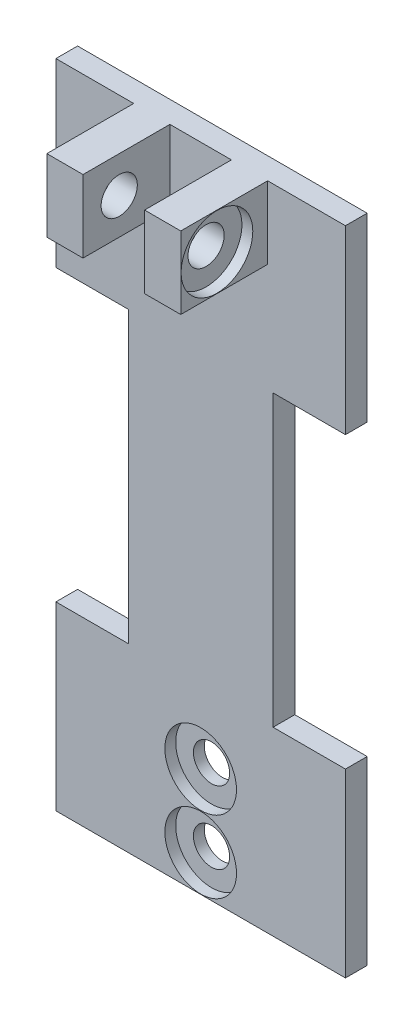
ISO-10303-21;
HEADER;
FILE_DESCRIPTION(('STEP AP214'),'2;1');
FILE_NAME('part.step','',(''),(''),'','','');
FILE_SCHEMA(('AUTOMOTIVE_DESIGN { 1 0 10303 214 1 1 1 1 }'));
ENDSEC;
DATA;
#1=APPLICATION_CONTEXT('core data for automotive mechanical design processes');
#2=APPLICATION_PROTOCOL_DEFINITION('international standard','automotive_design',2000,#1);
#3=PRODUCT_CONTEXT('',#1,'mechanical');
#4=PRODUCT('Part','Part','',(#3));
#5=PRODUCT_RELATED_PRODUCT_CATEGORY('part','',(#4));
#6=PRODUCT_DEFINITION_FORMATION('','',#4);
#7=PRODUCT_DEFINITION_CONTEXT('part definition',#1,'design');
#8=PRODUCT_DEFINITION('design','',#6,#7);
#9=PRODUCT_DEFINITION_SHAPE('','',#8);
#10=(LENGTH_UNIT() NAMED_UNIT(*) SI_UNIT(.MILLI.,.METRE.));
#11=(NAMED_UNIT(*) PLANE_ANGLE_UNIT() SI_UNIT($,.RADIAN.));
#12=(NAMED_UNIT(*) SI_UNIT($,.STERADIAN.) SOLID_ANGLE_UNIT());
#13=UNCERTAINTY_MEASURE_WITH_UNIT(LENGTH_MEASURE(1.E-05),#10,'distance_accuracy_value','');
#14=(GEOMETRIC_REPRESENTATION_CONTEXT(3) GLOBAL_UNCERTAINTY_ASSIGNED_CONTEXT((#13)) GLOBAL_UNIT_ASSIGNED_CONTEXT((#10,
#11,#12)) REPRESENTATION_CONTEXT('',''));
#15=CARTESIAN_POINT('',(0.,0.,0.));
#16=DIRECTION('',(0.,0.,1.));
#17=DIRECTION('',(1.,0.,0.));
#18=AXIS2_PLACEMENT_3D('',#15,#16,#17);
#19=CARTESIAN_POINT('',(0.,0.,3.));
#20=DIRECTION('',(0.,0.,1.));
#21=DIRECTION('',(1.,0.,0.));
#22=AXIS2_PLACEMENT_3D('',#19,#20,#21);
#23=PLANE('',#22);
#24=CARTESIAN_POINT('',(-14.0258823100703,-9.69647058823528,3.));
#25=DIRECTION('',(0.,0.,1.));
#26=DIRECTION('',(1.,0.,0.));
#27=AXIS2_PLACEMENT_3D('',#24,#25,#26);
#28=CIRCLE('',#27,4.95);
#29=CARTESIAN_POINT('',(-9.07588231007033,-9.69647058823528,3.));
#30=VERTEX_POINT('',#29);
#31=EDGE_CURVE('E313',#30,#30,#28,.T.);
#32=ORIENTED_EDGE('',*,*,#31,.F.);
#33=EDGE_LOOP('',(#32));
#34=FACE_BOUND('',#33,.T.);
#35=CARTESIAN_POINT('',(-14.0258823100703,0.303529411764716,3.));
#36=DIRECTION('',(0.,0.,1.));
#37=DIRECTION('',(1.,0.,0.));
#38=AXIS2_PLACEMENT_3D('',#35,#36,#37);
#39=CIRCLE('',#38,4.95);
#40=CARTESIAN_POINT('',(-9.07588231007033,0.303529411764716,3.));
#41=VERTEX_POINT('',#40);
#42=EDGE_CURVE('E317',#41,#41,#39,.T.);
#43=ORIENTED_EDGE('',*,*,#42,.F.);
#44=EDGE_LOOP('',(#43));
#45=FACE_BOUND('',#44,.T.);
#46=DIRECTION('',(1.,0.,0.));
#47=VECTOR('',#46,1.);
#48=CARTESIAN_POINT('',(0.,75.3035294117647,3.));
#49=LINE('',#48,#47);
#50=CARTESIAN_POINT('',(-18.2758823100703,75.3035294117647,3.));
#51=VERTEX_POINT('',#50);
#52=CARTESIAN_POINT('',(-9.77588231007033,75.3035294117647,3.));
#53=VERTEX_POINT('',#52);
#54=EDGE_CURVE('E61',#51,#53,#49,.T.);
#55=ORIENTED_EDGE('',*,*,#54,.F.);
#56=DIRECTION('',(0.,-1.,0.));
#57=VECTOR('',#56,1.);
#58=CARTESIAN_POINT('',(-18.2758823100703,0.,3.));
#59=LINE('',#58,#57);
#60=CARTESIAN_POINT('',(-18.2758823100703,65.3035294117647,3.));
#61=VERTEX_POINT('',#60);
#62=EDGE_CURVE('E213',#51,#61,#59,.T.);
#63=ORIENTED_EDGE('',*,*,#62,.T.);
#64=DIRECTION('',(1.,0.,0.));
#65=VECTOR('',#64,1.);
#66=CARTESIAN_POINT('',(0.,65.3035294117647,3.));
#67=LINE('',#66,#65);
#68=CARTESIAN_POINT('',(-23.2758823100703,65.3035294117647,3.));
#69=VERTEX_POINT('',#68);
#70=EDGE_CURVE('E55',#69,#61,#67,.T.);
#71=ORIENTED_EDGE('',*,*,#70,.F.);
#72=DIRECTION('',(0.,-1.,0.));
#73=VECTOR('',#72,1.);
#74=CARTESIAN_POINT('',(-23.2758823100703,0.,3.));
#75=LINE('',#74,#73);
#76=CARTESIAN_POINT('',(-23.2758823100703,75.3035294117647,3.));
#77=VERTEX_POINT('',#76);
#78=EDGE_CURVE('E210',#77,#69,#75,.T.);
#79=ORIENTED_EDGE('',*,*,#78,.F.);
#80=CARTESIAN_POINT('',(-34.0258823100703,75.3035294117647,3.));
#81=VERTEX_POINT('',#80);
#82=EDGE_CURVE('E281',#81,#77,#49,.T.);
#83=ORIENTED_EDGE('',*,*,#82,.F.);
#84=DIRECTION('',(0.,-1.,0.));
#85=VECTOR('',#84,1.);
#86=CARTESIAN_POINT('',(-34.0258823100703,0.,3.));
#87=LINE('',#86,#85);
#88=CARTESIAN_POINT('',(-34.0258823100703,50.3035294117647,3.));
#89=VERTEX_POINT('',#88);
#90=EDGE_CURVE('E285',#81,#89,#87,.T.);
#91=ORIENTED_EDGE('',*,*,#90,.T.);
#92=DIRECTION('',(1.,0.,0.));
#93=VECTOR('',#92,1.);
#94=CARTESIAN_POINT('',(0.,50.3035294117647,3.));
#95=LINE('',#94,#93);
#96=CARTESIAN_POINT('',(-24.0258823100703,50.3035294117647,3.));
#97=VERTEX_POINT('',#96);
#98=EDGE_CURVE('E288',#89,#97,#95,.T.);
#99=ORIENTED_EDGE('',*,*,#98,.T.);
#100=DIRECTION('',(0.,-1.,0.));
#101=VECTOR('',#100,1.);
#102=CARTESIAN_POINT('',(-24.0258823100703,0.,3.));
#103=LINE('',#102,#101);
#104=CARTESIAN_POINT('',(-24.0258823100703,10.3035294117647,3.));
#105=VERTEX_POINT('',#104);
#106=EDGE_CURVE('E292',#97,#105,#103,.T.);
#107=ORIENTED_EDGE('',*,*,#106,.T.);
#108=DIRECTION('',(1.,0.,0.));
#109=VECTOR('',#108,1.);
#110=CARTESIAN_POINT('',(0.,10.3035294117647,3.));
#111=LINE('',#110,#109);
#112=CARTESIAN_POINT('',(-34.0258823100703,10.3035294117647,3.));
#113=VERTEX_POINT('',#112);
#114=EDGE_CURVE('E295',#113,#105,#111,.T.);
#115=ORIENTED_EDGE('',*,*,#114,.F.);
#116=CARTESIAN_POINT('',(-34.0258823100703,-14.6964705882353,3.));
#117=VERTEX_POINT('',#116);
#118=EDGE_CURVE('E289',#113,#117,#87,.T.);
#119=ORIENTED_EDGE('',*,*,#118,.T.);
#120=DIRECTION('',(1.,0.,0.));
#121=VECTOR('',#120,1.);
#122=CARTESIAN_POINT('',(0.,-14.6964705882353,3.));
#123=LINE('',#122,#121);
#124=CARTESIAN_POINT('',(5.97411768992968,-14.6964705882353,3.));
#125=VERTEX_POINT('',#124);
#126=EDGE_CURVE('E299',#117,#125,#123,.T.);
#127=ORIENTED_EDGE('',*,*,#126,.T.);
#128=DIRECTION('',(0.,-1.,0.));
#129=VECTOR('',#128,1.);
#130=CARTESIAN_POINT('',(5.97411768992968,0.,3.));
#131=LINE('',#130,#129);
#132=CARTESIAN_POINT('',(5.97411768992968,10.3035294117648,3.));
#133=VERTEX_POINT('',#132);
#134=EDGE_CURVE('E280',#133,#125,#131,.T.);
#135=ORIENTED_EDGE('',*,*,#134,.F.);
#136=DIRECTION('',(-1.,0.,0.));
#137=VECTOR('',#136,1.);
#138=CARTESIAN_POINT('',(0.,10.3035294117648,3.));
#139=LINE('',#138,#137);
#140=CARTESIAN_POINT('',(-4.02588231007036,10.3035294117648,3.));
#141=VERTEX_POINT('',#140);
#142=EDGE_CURVE('E302',#133,#141,#139,.T.);
#143=ORIENTED_EDGE('',*,*,#142,.T.);
#144=DIRECTION('',(0.,-1.,0.));
#145=VECTOR('',#144,1.);
#146=CARTESIAN_POINT('',(-4.02588231007036,0.,3.));
#147=LINE('',#146,#145);
#148=CARTESIAN_POINT('',(-4.02588231007036,50.3035294117647,3.));
#149=VERTEX_POINT('',#148);
#150=EDGE_CURVE('E305',#149,#141,#147,.T.);
#151=ORIENTED_EDGE('',*,*,#150,.F.);
#152=DIRECTION('',(-1.,0.,0.));
#153=VECTOR('',#152,1.);
#154=CARTESIAN_POINT('',(0.,50.3035294117647,3.));
#155=LINE('',#154,#153);
#156=CARTESIAN_POINT('',(5.97411768992967,50.3035294117647,3.));
#157=VERTEX_POINT('',#156);
#158=EDGE_CURVE('E309',#157,#149,#155,.T.);
#159=ORIENTED_EDGE('',*,*,#158,.F.);
#160=CARTESIAN_POINT('',(5.97411768992967,75.3035294117647,3.));
#161=VERTEX_POINT('',#160);
#162=EDGE_CURVE('E274',#161,#157,#131,.T.);
#163=ORIENTED_EDGE('',*,*,#162,.F.);
#164=CARTESIAN_POINT('',(-4.77588231007033,75.3035294117647,3.));
#165=VERTEX_POINT('',#164);
#166=EDGE_CURVE('E278',#165,#161,#49,.T.);
#167=ORIENTED_EDGE('',*,*,#166,.F.);
#168=DIRECTION('',(0.,-1.,0.));
#169=VECTOR('',#168,1.);
#170=CARTESIAN_POINT('',(-4.77588231007033,0.,3.));
#171=LINE('',#170,#169);
#172=CARTESIAN_POINT('',(-4.77588231007033,65.3035294117647,3.));
#173=VERTEX_POINT('',#172);
#174=EDGE_CURVE('E249',#165,#173,#171,.T.);
#175=ORIENTED_EDGE('',*,*,#174,.T.);
#176=DIRECTION('',(-1.,0.,0.));
#177=VECTOR('',#176,1.);
#178=CARTESIAN_POINT('',(0.,65.3035294117647,3.));
#179=LINE('',#178,#177);
#180=CARTESIAN_POINT('',(-9.77588231007033,65.3035294117647,3.));
#181=VERTEX_POINT('',#180);
#182=EDGE_CURVE('E253',#173,#181,#179,.T.);
#183=ORIENTED_EDGE('',*,*,#182,.T.);
#184=DIRECTION('',(0.,1.,0.));
#185=VECTOR('',#184,1.);
#186=CARTESIAN_POINT('',(-9.77588231007033,0.,3.));
#187=LINE('',#186,#185);
#188=EDGE_CURVE('E246',#181,#53,#187,.T.);
#189=ORIENTED_EDGE('',*,*,#188,.T.);
#190=EDGE_LOOP('',(#55,#63,#71,#79,#83,#91,#99,#107,#115,#119,#127,#135,#143,#151,#159,#163,
#167,#175,#183,#189));
#191=FACE_BOUND('',#190,.T.);
#192=ADVANCED_FACE('F39',(#34,#45,#191),#23,.T.);
#193=CARTESIAN_POINT('',(5.97411768992968,0.,3.));
#194=DIRECTION('',(1.,0.,0.));
#195=DIRECTION('',(0.,1.,0.));
#196=AXIS2_PLACEMENT_3D('',#193,#194,#195);
#197=PLANE('',#196);
#198=DIRECTION('',(0.,-1.,0.));
#199=VECTOR('',#198,1.);
#200=CARTESIAN_POINT('',(5.97411768992968,0.,0.));
#201=LINE('',#200,#199);
#202=CARTESIAN_POINT('',(5.97411768992967,75.3035294117647,0.));
#203=VERTEX_POINT('',#202);
#204=CARTESIAN_POINT('',(5.97411768992967,50.3035294117647,0.));
#205=VERTEX_POINT('',#204);
#206=EDGE_CURVE('E270',#203,#205,#201,.T.);
#207=ORIENTED_EDGE('',*,*,#206,.F.);
#208=DIRECTION('',(0.,0.,-1.));
#209=VECTOR('',#208,1.);
#210=CARTESIAN_POINT('',(5.97411768992967,75.3035294117647,3.));
#211=LINE('',#210,#209);
#212=EDGE_CURVE('E394',#161,#203,#211,.T.);
#213=ORIENTED_EDGE('',*,*,#212,.F.);
#214=ORIENTED_EDGE('',*,*,#162,.T.);
#215=DIRECTION('',(0.,0.,-1.));
#216=VECTOR('',#215,1.);
#217=CARTESIAN_POINT('',(5.97411768992967,50.3035294117647,3.));
#218=LINE('',#217,#216);
#219=EDGE_CURVE('E321',#157,#205,#218,.T.);
#220=ORIENTED_EDGE('',*,*,#219,.T.);
#221=EDGE_LOOP('',(#207,#213,#214,#220));
#222=FACE_BOUND('',#221,.T.);
#223=ADVANCED_FACE('F412',(#222),#197,.T.);
#224=CARTESIAN_POINT('',(0.,75.3035294117647,3.));
#225=DIRECTION('',(0.,1.,0.));
#226=DIRECTION('',(0.,0.,1.));
#227=AXIS2_PLACEMENT_3D('',#224,#225,#226);
#228=PLANE('',#227);
#229=ORIENTED_EDGE('',*,*,#82,.T.);
#230=DIRECTION('',(0.,0.,-1.));
#231=VECTOR('',#230,1.);
#232=CARTESIAN_POINT('',(-23.2758823100703,75.3035294117647,15.));
#233=LINE('',#232,#231);
#234=CARTESIAN_POINT('',(-23.2758823100703,75.3035294117647,15.));
#235=VERTEX_POINT('',#234);
#236=EDGE_CURVE('E814',#235,#77,#233,.T.);
#237=ORIENTED_EDGE('',*,*,#236,.F.);
#238=DIRECTION('',(-1.,0.,0.));
#239=VECTOR('',#238,1.);
#240=CARTESIAN_POINT('',(-18.2758823100703,75.3035294117647,15.));
#241=LINE('',#240,#239);
#242=CARTESIAN_POINT('',(-18.2758823100703,75.3035294117647,15.));
#243=VERTEX_POINT('',#242);
#244=EDGE_CURVE('E194',#243,#235,#241,.T.);
#245=ORIENTED_EDGE('',*,*,#244,.F.);
#246=DIRECTION('',(0.,0.,-1.));
#247=VECTOR('',#246,1.);
#248=CARTESIAN_POINT('',(-18.2758823100703,75.3035294117647,15.));
#249=LINE('',#248,#247);
#250=EDGE_CURVE('E191',#243,#51,#249,.T.);
#251=ORIENTED_EDGE('',*,*,#250,.T.);
#252=ORIENTED_EDGE('',*,*,#54,.T.);
#253=DIRECTION('',(0.,0.,-1.));
#254=VECTOR('',#253,1.);
#255=CARTESIAN_POINT('',(-9.77588231007033,75.3035294117647,15.));
#256=LINE('',#255,#254);
#257=CARTESIAN_POINT('',(-9.77588231007033,75.3035294117647,15.));
#258=VERTEX_POINT('',#257);
#259=EDGE_CURVE('E234',#258,#53,#256,.T.);
#260=ORIENTED_EDGE('',*,*,#259,.F.);
#261=DIRECTION('',(1.,0.,0.));
#262=VECTOR('',#261,1.);
#263=CARTESIAN_POINT('',(0.,75.3035294117647,15.));
#264=LINE('',#263,#262);
#265=CARTESIAN_POINT('',(-4.77588231007033,75.3035294117647,15.));
#266=VERTEX_POINT('',#265);
#267=EDGE_CURVE('E223',#258,#266,#264,.T.);
#268=ORIENTED_EDGE('',*,*,#267,.T.);
#269=DIRECTION('',(0.,0.,-1.));
#270=VECTOR('',#269,1.);
#271=CARTESIAN_POINT('',(-4.77588231007033,75.3035294117647,15.));
#272=LINE('',#271,#270);
#273=EDGE_CURVE('E238',#266,#165,#272,.T.);
#274=ORIENTED_EDGE('',*,*,#273,.T.);
#275=ORIENTED_EDGE('',*,*,#166,.T.);
#276=ORIENTED_EDGE('',*,*,#212,.T.);
#277=DIRECTION('',(1.,0.,0.));
#278=VECTOR('',#277,1.);
#279=CARTESIAN_POINT('',(0.,75.3035294117647,0.));
#280=LINE('',#279,#278);
#281=CARTESIAN_POINT('',(-34.0258823100703,75.3035294117647,0.));
#282=VERTEX_POINT('',#281);
#283=EDGE_CURVE('E325',#282,#203,#280,.T.);
#284=ORIENTED_EDGE('',*,*,#283,.F.);
#285=DIRECTION('',(0.,0.,-1.));
#286=VECTOR('',#285,1.);
#287=CARTESIAN_POINT('',(-34.0258823100703,75.3035294117647,3.));
#288=LINE('',#287,#286);
#289=EDGE_CURVE('E391',#81,#282,#288,.T.);
#290=ORIENTED_EDGE('',*,*,#289,.F.);
#291=EDGE_LOOP('',(#229,#237,#245,#251,#252,#260,#268,#274,#275,#276,#284,#290));
#292=FACE_BOUND('',#291,.T.);
#293=ADVANCED_FACE('F41',(#292),#228,.T.);
#294=CARTESIAN_POINT('',(-34.0258823100703,0.,3.));
#295=DIRECTION('',(1.,0.,0.));
#296=DIRECTION('',(0.,1.,0.));
#297=AXIS2_PLACEMENT_3D('',#294,#295,#296);
#298=PLANE('',#297);
#299=DIRECTION('',(0.,-1.,0.));
#300=VECTOR('',#299,1.);
#301=CARTESIAN_POINT('',(-34.0258823100703,0.,0.));
#302=LINE('',#301,#300);
#303=CARTESIAN_POINT('',(-34.0258823100703,50.3035294117647,0.));
#304=VERTEX_POINT('',#303);
#305=EDGE_CURVE('E329',#282,#304,#302,.T.);
#306=ORIENTED_EDGE('',*,*,#305,.T.);
#307=DIRECTION('',(0.,0.,-1.));
#308=VECTOR('',#307,1.);
#309=CARTESIAN_POINT('',(-34.0258823100703,50.3035294117647,3.));
#310=LINE('',#309,#308);
#311=EDGE_CURVE('E387',#89,#304,#310,.T.);
#312=ORIENTED_EDGE('',*,*,#311,.F.);
#313=ORIENTED_EDGE('',*,*,#90,.F.);
#314=ORIENTED_EDGE('',*,*,#289,.T.);
#315=EDGE_LOOP('',(#306,#312,#313,#314));
#316=FACE_BOUND('',#315,.T.);
#317=ADVANCED_FACE('F455',(#316),#298,.F.);
#318=CARTESIAN_POINT('',(0.,50.3035294117647,3.));
#319=DIRECTION('',(0.,1.,0.));
#320=DIRECTION('',(0.,0.,1.));
#321=AXIS2_PLACEMENT_3D('',#318,#319,#320);
#322=PLANE('',#321);
#323=DIRECTION('',(1.,0.,0.));
#324=VECTOR('',#323,1.);
#325=CARTESIAN_POINT('',(0.,50.3035294117647,0.));
#326=LINE('',#325,#324);
#327=CARTESIAN_POINT('',(-24.0258823100703,50.3035294117647,0.));
#328=VERTEX_POINT('',#327);
#329=EDGE_CURVE('E332',#304,#328,#326,.T.);
#330=ORIENTED_EDGE('',*,*,#329,.T.);
#331=DIRECTION('',(0.,0.,-1.));
#332=VECTOR('',#331,1.);
#333=CARTESIAN_POINT('',(-24.0258823100703,50.3035294117647,3.));
#334=LINE('',#333,#332);
#335=EDGE_CURVE('E383',#97,#328,#334,.T.);
#336=ORIENTED_EDGE('',*,*,#335,.F.);
#337=ORIENTED_EDGE('',*,*,#98,.F.);
#338=ORIENTED_EDGE('',*,*,#311,.T.);
#339=EDGE_LOOP('',(#330,#336,#337,#338));
#340=FACE_BOUND('',#339,.T.);
#341=ADVANCED_FACE('F461',(#340),#322,.F.);
#342=CARTESIAN_POINT('',(-24.0258823100703,0.,3.));
#343=DIRECTION('',(1.,0.,0.));
#344=DIRECTION('',(0.,1.,0.));
#345=AXIS2_PLACEMENT_3D('',#342,#343,#344);
#346=PLANE('',#345);
#347=DIRECTION('',(0.,-1.,0.));
#348=VECTOR('',#347,1.);
#349=CARTESIAN_POINT('',(-24.0258823100703,0.,0.));
#350=LINE('',#349,#348);
#351=CARTESIAN_POINT('',(-24.0258823100703,10.3035294117647,0.));
#352=VERTEX_POINT('',#351);
#353=EDGE_CURVE('E336',#328,#352,#350,.T.);
#354=ORIENTED_EDGE('',*,*,#353,.T.);
#355=DIRECTION('',(0.,0.,-1.));
#356=VECTOR('',#355,1.);
#357=CARTESIAN_POINT('',(-24.0258823100703,10.3035294117647,3.));
#358=LINE('',#357,#356);
#359=EDGE_CURVE('E380',#105,#352,#358,.T.);
#360=ORIENTED_EDGE('',*,*,#359,.F.);
#361=ORIENTED_EDGE('',*,*,#106,.F.);
#362=ORIENTED_EDGE('',*,*,#335,.T.);
#363=EDGE_LOOP('',(#354,#360,#361,#362));
#364=FACE_BOUND('',#363,.T.);
#365=ADVANCED_FACE('F458',(#364),#346,.F.);
#366=CARTESIAN_POINT('',(0.,10.3035294117647,3.));
#367=DIRECTION('',(0.,1.,0.));
#368=DIRECTION('',(-1.,0.,0.));
#369=AXIS2_PLACEMENT_3D('',#366,#367,#368);
#370=PLANE('',#369);
#371=DIRECTION('',(1.,0.,0.));
#372=VECTOR('',#371,1.);
#373=CARTESIAN_POINT('',(0.,10.3035294117647,0.));
#374=LINE('',#373,#372);
#375=CARTESIAN_POINT('',(-34.0258823100703,10.3035294117647,0.));
#376=VERTEX_POINT('',#375);
#377=EDGE_CURVE('E340',#376,#352,#374,.T.);
#378=ORIENTED_EDGE('',*,*,#377,.F.);
#379=DIRECTION('',(0.,0.,-1.));
#380=VECTOR('',#379,1.);
#381=CARTESIAN_POINT('',(-34.0258823100703,10.3035294117647,3.));
#382=LINE('',#381,#380);
#383=EDGE_CURVE('E377',#113,#376,#382,.T.);
#384=ORIENTED_EDGE('',*,*,#383,.F.);
#385=ORIENTED_EDGE('',*,*,#114,.T.);
#386=ORIENTED_EDGE('',*,*,#359,.T.);
#387=EDGE_LOOP('',(#378,#384,#385,#386));
#388=FACE_BOUND('',#387,.T.);
#389=ADVANCED_FACE('F453',(#388),#370,.T.);
#390=CARTESIAN_POINT('',(-34.0258823100703,-14.6964705882353,0.));
#391=VERTEX_POINT('',#390);
#392=EDGE_CURVE('E333',#376,#391,#302,.T.);
#393=ORIENTED_EDGE('',*,*,#392,.T.);
#394=DIRECTION('',(0.,0.,-1.));
#395=VECTOR('',#394,1.);
#396=CARTESIAN_POINT('',(-34.0258823100703,-14.6964705882353,3.));
#397=LINE('',#396,#395);
#398=EDGE_CURVE('E373',#117,#391,#397,.T.);
#399=ORIENTED_EDGE('',*,*,#398,.F.);
#400=ORIENTED_EDGE('',*,*,#118,.F.);
#401=ORIENTED_EDGE('',*,*,#383,.T.);
#402=EDGE_LOOP('',(#393,#399,#400,#401));
#403=FACE_BOUND('',#402,.T.);
#404=ADVANCED_FACE('F449',(#403),#298,.F.);
#405=CARTESIAN_POINT('',(0.,-14.6964705882353,3.));
#406=DIRECTION('',(0.,1.,0.));
#407=DIRECTION('',(0.,0.,1.));
#408=AXIS2_PLACEMENT_3D('',#405,#406,#407);
#409=PLANE('',#408);
#410=DIRECTION('',(1.,0.,0.));
#411=VECTOR('',#410,1.);
#412=CARTESIAN_POINT('',(0.,-14.6964705882353,0.));
#413=LINE('',#412,#411);
#414=CARTESIAN_POINT('',(5.97411768992968,-14.6964705882353,0.));
#415=VERTEX_POINT('',#414);
#416=EDGE_CURVE('E344',#391,#415,#413,.T.);
#417=ORIENTED_EDGE('',*,*,#416,.T.);
#418=DIRECTION('',(0.,0.,-1.));
#419=VECTOR('',#418,1.);
#420=CARTESIAN_POINT('',(5.97411768992968,-14.6964705882353,3.));
#421=LINE('',#420,#419);
#422=EDGE_CURVE('E370',#125,#415,#421,.T.);
#423=ORIENTED_EDGE('',*,*,#422,.F.);
#424=ORIENTED_EDGE('',*,*,#126,.F.);
#425=ORIENTED_EDGE('',*,*,#398,.T.);
#426=EDGE_LOOP('',(#417,#423,#424,#425));
#427=FACE_BOUND('',#426,.T.);
#428=ADVANCED_FACE('F445',(#427),#409,.F.);
#429=CARTESIAN_POINT('',(5.97411768992968,10.3035294117648,0.));
#430=VERTEX_POINT('',#429);
#431=EDGE_CURVE('E326',#430,#415,#201,.T.);
#432=ORIENTED_EDGE('',*,*,#431,.F.);
#433=DIRECTION('',(0.,0.,-1.));
#434=VECTOR('',#433,1.);
#435=CARTESIAN_POINT('',(5.97411768992968,10.3035294117648,3.));
#436=LINE('',#435,#434);
#437=EDGE_CURVE('E367',#133,#430,#436,.T.);
#438=ORIENTED_EDGE('',*,*,#437,.F.);
#439=ORIENTED_EDGE('',*,*,#134,.T.);
#440=ORIENTED_EDGE('',*,*,#422,.T.);
#441=EDGE_LOOP('',(#432,#438,#439,#440));
#442=FACE_BOUND('',#441,.T.);
#443=ADVANCED_FACE('F420',(#442),#197,.T.);
#444=CARTESIAN_POINT('',(0.,10.3035294117648,3.));
#445=DIRECTION('',(0.,-1.,0.));
#446=DIRECTION('',(1.,0.,0.));
#447=AXIS2_PLACEMENT_3D('',#444,#445,#446);
#448=PLANE('',#447);
#449=DIRECTION('',(-1.,0.,0.));
#450=VECTOR('',#449,1.);
#451=CARTESIAN_POINT('',(0.,10.3035294117648,0.));
#452=LINE('',#451,#450);
#453=CARTESIAN_POINT('',(-4.02588231007036,10.3035294117648,0.));
#454=VERTEX_POINT('',#453);
#455=EDGE_CURVE('E348',#430,#454,#452,.T.);
#456=ORIENTED_EDGE('',*,*,#455,.T.);
#457=DIRECTION('',(0.,0.,-1.));
#458=VECTOR('',#457,1.);
#459=CARTESIAN_POINT('',(-4.02588231007036,10.3035294117648,3.));
#460=LINE('',#459,#458);
#461=EDGE_CURVE('E364',#141,#454,#460,.T.);
#462=ORIENTED_EDGE('',*,*,#461,.F.);
#463=ORIENTED_EDGE('',*,*,#142,.F.);
#464=ORIENTED_EDGE('',*,*,#437,.T.);
#465=EDGE_LOOP('',(#456,#462,#463,#464));
#466=FACE_BOUND('',#465,.T.);
#467=ADVANCED_FACE('F439',(#466),#448,.F.);
#468=CARTESIAN_POINT('',(-4.02588231007036,0.,3.));
#469=DIRECTION('',(1.,0.,0.));
#470=DIRECTION('',(0.,1.,0.));
#471=AXIS2_PLACEMENT_3D('',#468,#469,#470);
#472=PLANE('',#471);
#473=DIRECTION('',(0.,-1.,0.));
#474=VECTOR('',#473,1.);
#475=CARTESIAN_POINT('',(-4.02588231007036,0.,0.));
#476=LINE('',#475,#474);
#477=CARTESIAN_POINT('',(-4.02588231007036,50.3035294117647,0.));
#478=VERTEX_POINT('',#477);
#479=EDGE_CURVE('E352',#478,#454,#476,.T.);
#480=ORIENTED_EDGE('',*,*,#479,.F.);
#481=DIRECTION('',(0.,0.,-1.));
#482=VECTOR('',#481,1.);
#483=CARTESIAN_POINT('',(-4.02588231007036,50.3035294117647,3.));
#484=LINE('',#483,#482);
#485=EDGE_CURVE('E361',#149,#478,#484,.T.);
#486=ORIENTED_EDGE('',*,*,#485,.F.);
#487=ORIENTED_EDGE('',*,*,#150,.T.);
#488=ORIENTED_EDGE('',*,*,#461,.T.);
#489=EDGE_LOOP('',(#480,#486,#487,#488));
#490=FACE_BOUND('',#489,.T.);
#491=ADVANCED_FACE('F432',(#490),#472,.T.);
#492=CARTESIAN_POINT('',(-14.0258823100703,-9.69647058823528,3.));
#493=DIRECTION('',(0.,0.,-1.));
#494=DIRECTION('',(-1.,0.,0.));
#495=AXIS2_PLACEMENT_3D('',#492,#493,#494);
#496=CYLINDRICAL_SURFACE('',#495,4.95);
#497=CARTESIAN_POINT('',(-14.0258823100703,-9.69647058823528,1.5));
#498=DIRECTION('',(0.,0.,1.));
#499=DIRECTION('',(1.,0.,0.));
#500=AXIS2_PLACEMENT_3D('',#497,#498,#499);
#501=CIRCLE('',#500,4.95);
#502=CARTESIAN_POINT('',(-9.07588231007033,-9.69647058823528,1.5));
#503=VERTEX_POINT('',#502);
#504=EDGE_CURVE('E11',#503,#503,#501,.T.);
#505=ORIENTED_EDGE('',*,*,#504,.F.);
#506=EDGE_LOOP('',(#505));
#507=FACE_BOUND('',#506,.T.);
#508=ORIENTED_EDGE('',*,*,#31,.T.);
#509=EDGE_LOOP('',(#508));
#510=FACE_BOUND('',#509,.T.);
#511=ADVANCED_FACE('F429',(#507,#510),#496,.F.);
#512=CARTESIAN_POINT('',(0.,50.3035294117647,3.));
#513=DIRECTION('',(0.,-1.,0.));
#514=DIRECTION('',(0.,0.,-1.));
#515=AXIS2_PLACEMENT_3D('',#512,#513,#514);
#516=PLANE('',#515);
#517=DIRECTION('',(-1.,0.,0.));
#518=VECTOR('',#517,1.);
#519=CARTESIAN_POINT('',(0.,50.3035294117647,0.));
#520=LINE('',#519,#518);
#521=EDGE_CURVE('E279',#205,#478,#520,.T.);
#522=ORIENTED_EDGE('',*,*,#521,.F.);
#523=ORIENTED_EDGE('',*,*,#219,.F.);
#524=ORIENTED_EDGE('',*,*,#158,.T.);
#525=ORIENTED_EDGE('',*,*,#485,.T.);
#526=EDGE_LOOP('',(#522,#523,#524,#525));
#527=FACE_BOUND('',#526,.T.);
#528=ADVANCED_FACE('F407',(#527),#516,.T.);
#529=CARTESIAN_POINT('',(-14.0258823100703,0.303529411764716,3.));
#530=DIRECTION('',(0.,0.,-1.));
#531=DIRECTION('',(-1.,0.,0.));
#532=AXIS2_PLACEMENT_3D('',#529,#530,#531);
#533=CYLINDRICAL_SURFACE('',#532,4.95);
#534=CARTESIAN_POINT('',(-14.0258823100703,0.303529411764716,1.5));
#535=DIRECTION('',(0.,0.,1.));
#536=DIRECTION('',(1.,0.,0.));
#537=AXIS2_PLACEMENT_3D('',#534,#535,#536);
#538=CIRCLE('',#537,4.95);
#539=CARTESIAN_POINT('',(-9.07588231007033,0.303529411764716,1.5));
#540=VERTEX_POINT('',#539);
#541=EDGE_CURVE('E48',#540,#540,#538,.T.);
#542=ORIENTED_EDGE('',*,*,#541,.F.);
#543=EDGE_LOOP('',(#542));
#544=FACE_BOUND('',#543,.T.);
#545=ORIENTED_EDGE('',*,*,#42,.T.);
#546=EDGE_LOOP('',(#545));
#547=FACE_BOUND('',#546,.T.);
#548=ADVANCED_FACE('F403',(#544,#547),#533,.F.);
#549=CARTESIAN_POINT('',(0.,0.,0.));
#550=DIRECTION('',(0.,0.,1.));
#551=DIRECTION('',(1.,0.,0.));
#552=AXIS2_PLACEMENT_3D('',#549,#550,#551);
#553=PLANE('',#552);
#554=ORIENTED_EDGE('',*,*,#283,.T.);
#555=ORIENTED_EDGE('',*,*,#206,.T.);
#556=ORIENTED_EDGE('',*,*,#521,.T.);
#557=ORIENTED_EDGE('',*,*,#479,.T.);
#558=ORIENTED_EDGE('',*,*,#455,.F.);
#559=ORIENTED_EDGE('',*,*,#431,.T.);
#560=ORIENTED_EDGE('',*,*,#416,.F.);
#561=ORIENTED_EDGE('',*,*,#392,.F.);
#562=ORIENTED_EDGE('',*,*,#377,.T.);
#563=ORIENTED_EDGE('',*,*,#353,.F.);
#564=ORIENTED_EDGE('',*,*,#329,.F.);
#565=ORIENTED_EDGE('',*,*,#305,.F.);
#566=EDGE_LOOP('',(#554,#555,#556,#557,#558,#559,#560,#561,#562,#563,#564,#565));
#567=FACE_BOUND('',#566,.T.);
#568=CARTESIAN_POINT('',(-14.0258823100703,0.303529411764716,0.));
#569=DIRECTION('',(0.,0.,1.));
#570=DIRECTION('',(1.,0.,0.));
#571=AXIS2_PLACEMENT_3D('',#568,#569,#570);
#572=CIRCLE('',#571,2.5);
#573=CARTESIAN_POINT('',(-11.5258823100703,0.303529411764716,0.));
#574=VERTEX_POINT('',#573);
#575=EDGE_CURVE('E262',#574,#574,#572,.T.);
#576=ORIENTED_EDGE('',*,*,#575,.T.);
#577=EDGE_LOOP('',(#576));
#578=FACE_BOUND('',#577,.T.);
#579=CARTESIAN_POINT('',(-14.0258823100703,-9.69647058823528,0.));
#580=DIRECTION('',(0.,0.,1.));
#581=DIRECTION('',(1.,0.,0.));
#582=AXIS2_PLACEMENT_3D('',#579,#580,#581);
#583=CIRCLE('',#582,2.5);
#584=CARTESIAN_POINT('',(-11.5258823100703,-9.69647058823528,0.));
#585=VERTEX_POINT('',#584);
#586=EDGE_CURVE('E257',#585,#585,#583,.T.);
#587=ORIENTED_EDGE('',*,*,#586,.T.);
#588=EDGE_LOOP('',(#587));
#589=FACE_BOUND('',#588,.T.);
#590=ADVANCED_FACE('F406',(#567,#578,#589),#553,.F.);
#591=CARTESIAN_POINT('',(-14.0258823100703,0.303529411764716,1.5));
#592=DIRECTION('',(0.,0.,-1.));
#593=DIRECTION('',(-1.,0.,0.));
#594=AXIS2_PLACEMENT_3D('',#591,#592,#593);
#595=CYLINDRICAL_SURFACE('',#594,2.5);
#596=CARTESIAN_POINT('',(-14.0258823100703,0.303529411764716,1.5));
#597=DIRECTION('',(0.,0.,1.));
#598=DIRECTION('',(1.,0.,0.));
#599=AXIS2_PLACEMENT_3D('',#596,#597,#598);
#600=CIRCLE('',#599,2.5);
#601=CARTESIAN_POINT('',(-11.5258823100703,0.303529411764716,1.5));
#602=VERTEX_POINT('',#601);
#603=EDGE_CURVE('E266',#602,#602,#600,.T.);
#604=ORIENTED_EDGE('',*,*,#603,.T.);
#605=EDGE_LOOP('',(#604));
#606=FACE_BOUND('',#605,.T.);
#607=ORIENTED_EDGE('',*,*,#575,.F.);
#608=EDGE_LOOP('',(#607));
#609=FACE_BOUND('',#608,.T.);
#610=ADVANCED_FACE('F424',(#606,#609),#595,.F.);
#611=CARTESIAN_POINT('',(0.,0.,1.5));
#612=DIRECTION('',(0.,0.,1.));
#613=DIRECTION('',(1.,0.,0.));
#614=AXIS2_PLACEMENT_3D('',#611,#612,#613);
#615=PLANE('',#614);
#616=ORIENTED_EDGE('',*,*,#603,.F.);
#617=EDGE_LOOP('',(#616));
#618=FACE_BOUND('',#617,.T.);
#619=ORIENTED_EDGE('',*,*,#541,.T.);
#620=EDGE_LOOP('',(#619));
#621=FACE_BOUND('',#620,.T.);
#622=ADVANCED_FACE('F401',(#618,#621),#615,.T.);
#623=CARTESIAN_POINT('',(-14.0258823100703,-9.69647058823528,1.5));
#624=DIRECTION('',(0.,0.,-1.));
#625=DIRECTION('',(-1.,0.,0.));
#626=AXIS2_PLACEMENT_3D('',#623,#624,#625);
#627=CYLINDRICAL_SURFACE('',#626,2.5);
#628=CARTESIAN_POINT('',(-14.0258823100703,-9.69647058823528,1.5));
#629=DIRECTION('',(0.,0.,1.));
#630=DIRECTION('',(1.,0.,0.));
#631=AXIS2_PLACEMENT_3D('',#628,#629,#630);
#632=CIRCLE('',#631,2.5);
#633=CARTESIAN_POINT('',(-11.5258823100703,-9.69647058823528,1.5));
#634=VERTEX_POINT('',#633);
#635=EDGE_CURVE('E258',#634,#634,#632,.T.);
#636=ORIENTED_EDGE('',*,*,#635,.T.);
#637=EDGE_LOOP('',(#636));
#638=FACE_BOUND('',#637,.T.);
#639=ORIENTED_EDGE('',*,*,#586,.F.);
#640=EDGE_LOOP('',(#639));
#641=FACE_BOUND('',#640,.T.);
#642=ADVANCED_FACE('F547',(#638,#641),#627,.F.);
#643=CARTESIAN_POINT('',(0.,0.,1.5));
#644=DIRECTION('',(0.,0.,1.));
#645=DIRECTION('',(1.,0.,0.));
#646=AXIS2_PLACEMENT_3D('',#643,#644,#645);
#647=PLANE('',#646);
#648=ORIENTED_EDGE('',*,*,#635,.F.);
#649=EDGE_LOOP('',(#648));
#650=FACE_BOUND('',#649,.T.);
#651=ORIENTED_EDGE('',*,*,#504,.T.);
#652=EDGE_LOOP('',(#651));
#653=FACE_BOUND('',#652,.T.);
#654=ADVANCED_FACE('F544',(#650,#653),#647,.T.);
#655=CARTESIAN_POINT('',(0.,65.3035294117647,15.));
#656=DIRECTION('',(0.,1.,0.));
#657=DIRECTION('',(0.,0.,1.));
#658=AXIS2_PLACEMENT_3D('',#655,#656,#657);
#659=PLANE('',#658);
#660=ORIENTED_EDGE('',*,*,#182,.F.);
#661=DIRECTION('',(0.,0.,-1.));
#662=VECTOR('',#661,1.);
#663=CARTESIAN_POINT('',(-4.77588231007033,65.3035294117647,15.));
#664=LINE('',#663,#662);
#665=CARTESIAN_POINT('',(-4.77588231007033,65.3035294117647,15.));
#666=VERTEX_POINT('',#665);
#667=EDGE_CURVE('E242',#666,#173,#664,.T.);
#668=ORIENTED_EDGE('',*,*,#667,.F.);
#669=DIRECTION('',(1.,0.,0.));
#670=VECTOR('',#669,1.);
#671=CARTESIAN_POINT('',(0.,65.3035294117647,15.));
#672=LINE('',#671,#670);
#673=CARTESIAN_POINT('',(-9.77588231007033,65.3035294117647,15.));
#674=VERTEX_POINT('',#673);
#675=EDGE_CURVE('E216',#674,#666,#672,.T.);
#676=ORIENTED_EDGE('',*,*,#675,.F.);
#677=DIRECTION('',(0.,0.,-1.));
#678=VECTOR('',#677,1.);
#679=CARTESIAN_POINT('',(-9.77588231007033,65.3035294117647,15.));
#680=LINE('',#679,#678);
#681=EDGE_CURVE('E230',#674,#181,#680,.T.);
#682=ORIENTED_EDGE('',*,*,#681,.T.);
#683=EDGE_LOOP('',(#660,#668,#676,#682));
#684=FACE_BOUND('',#683,.T.);
#685=ADVANCED_FACE('F518',(#684),#659,.F.);
#686=CARTESIAN_POINT('',(-4.77588231007033,0.,15.));
#687=DIRECTION('',(-1.,0.,0.));
#688=DIRECTION('',(0.,0.,1.));
#689=AXIS2_PLACEMENT_3D('',#686,#687,#688);
#690=PLANE('',#689);
#691=CARTESIAN_POINT('',(-4.77588231007033,70.3035294117647,10.));
#692=DIRECTION('',(1.,0.,0.));
#693=DIRECTION('',(0.,0.,-1.));
#694=AXIS2_PLACEMENT_3D('',#691,#692,#693);
#695=CIRCLE('',#694,4.95);
#696=CARTESIAN_POINT('',(-4.77588231007033,70.3035294117647,5.05000000000001));
#697=VERTEX_POINT('',#696);
#698=EDGE_CURVE('E822',#697,#697,#695,.T.);
#699=ORIENTED_EDGE('',*,*,#698,.F.);
#700=EDGE_LOOP('',(#699));
#701=FACE_BOUND('',#700,.T.);
#702=ORIENTED_EDGE('',*,*,#174,.F.);
#703=ORIENTED_EDGE('',*,*,#273,.F.);
#704=DIRECTION('',(0.,1.,0.));
#705=VECTOR('',#704,1.);
#706=CARTESIAN_POINT('',(-4.77588231007033,0.,15.));
#707=LINE('',#706,#705);
#708=EDGE_CURVE('E220',#666,#266,#707,.T.);
#709=ORIENTED_EDGE('',*,*,#708,.F.);
#710=ORIENTED_EDGE('',*,*,#667,.T.);
#711=EDGE_LOOP('',(#702,#703,#709,#710));
#712=FACE_BOUND('',#711,.T.);
#713=ADVANCED_FACE('F521',(#701,#712),#690,.F.);
#714=CARTESIAN_POINT('',(-9.77588231007033,0.,15.));
#715=DIRECTION('',(1.,0.,0.));
#716=DIRECTION('',(0.,0.,-1.));
#717=AXIS2_PLACEMENT_3D('',#714,#715,#716);
#718=PLANE('',#717);
#719=CARTESIAN_POINT('',(-9.77588231007033,70.3035294117647,10.));
#720=DIRECTION('',(1.,0.,0.));
#721=DIRECTION('',(0.,0.,-1.));
#722=AXIS2_PLACEMENT_3D('',#719,#720,#721);
#723=CIRCLE('',#722,2.5);
#724=CARTESIAN_POINT('',(-9.77588231007033,70.3035294117647,7.5));
#725=VERTEX_POINT('',#724);
#726=EDGE_CURVE('E832',#725,#725,#723,.T.);
#727=ORIENTED_EDGE('',*,*,#726,.T.);
#728=EDGE_LOOP('',(#727));
#729=FACE_BOUND('',#728,.T.);
#730=ORIENTED_EDGE('',*,*,#188,.F.);
#731=ORIENTED_EDGE('',*,*,#681,.F.);
#732=DIRECTION('',(0.,-1.,0.));
#733=VECTOR('',#732,1.);
#734=CARTESIAN_POINT('',(-9.77588231007033,0.,15.));
#735=LINE('',#734,#733);
#736=EDGE_CURVE('E227',#258,#674,#735,.T.);
#737=ORIENTED_EDGE('',*,*,#736,.F.);
#738=ORIENTED_EDGE('',*,*,#259,.T.);
#739=EDGE_LOOP('',(#730,#731,#737,#738));
#740=FACE_BOUND('',#739,.T.);
#741=ADVANCED_FACE('F513',(#729,#740),#718,.F.);
#742=CARTESIAN_POINT('',(0.,0.,15.));
#743=DIRECTION('',(0.,0.,1.));
#744=DIRECTION('',(1.,0.,0.));
#745=AXIS2_PLACEMENT_3D('',#742,#743,#744);
#746=PLANE('',#745);
#747=ORIENTED_EDGE('',*,*,#675,.T.);
#748=ORIENTED_EDGE('',*,*,#708,.T.);
#749=ORIENTED_EDGE('',*,*,#267,.F.);
#750=ORIENTED_EDGE('',*,*,#736,.T.);
#751=EDGE_LOOP('',(#747,#748,#749,#750));
#752=FACE_BOUND('',#751,.T.);
#753=ADVANCED_FACE('F524',(#752),#746,.T.);
#754=CARTESIAN_POINT('',(-18.2758823100703,65.3035294117647,15.));
#755=DIRECTION('',(-1.,0.,0.));
#756=DIRECTION('',(0.,0.,1.));
#757=AXIS2_PLACEMENT_3D('',#754,#755,#756);
#758=PLANE('',#757);
#759=CARTESIAN_POINT('',(-18.2758823100703,70.3035294117647,10.));
#760=DIRECTION('',(-1.,0.,0.));
#761=DIRECTION('',(0.,0.,1.));
#762=AXIS2_PLACEMENT_3D('',#759,#760,#761);
#763=CIRCLE('',#762,2.5);
#764=CARTESIAN_POINT('',(-18.2758823100703,70.3035294117647,12.5));
#765=VERTEX_POINT('',#764);
#766=EDGE_CURVE('E839',#765,#765,#763,.T.);
#767=ORIENTED_EDGE('',*,*,#766,.T.);
#768=EDGE_LOOP('',(#767));
#769=FACE_BOUND('',#768,.T.);
#770=ORIENTED_EDGE('',*,*,#62,.F.);
#771=ORIENTED_EDGE('',*,*,#250,.F.);
#772=DIRECTION('',(0.,1.,0.));
#773=VECTOR('',#772,1.);
#774=CARTESIAN_POINT('',(-18.2758823100703,65.3035294117647,15.));
#775=LINE('',#774,#773);
#776=CARTESIAN_POINT('',(-18.2758823100703,65.3035294117647,15.));
#777=VERTEX_POINT('',#776);
#778=EDGE_CURVE('E188',#777,#243,#775,.T.);
#779=ORIENTED_EDGE('',*,*,#778,.F.);
#780=DIRECTION('',(0.,0.,-1.));
#781=VECTOR('',#780,1.);
#782=CARTESIAN_POINT('',(-18.2758823100703,65.3035294117647,15.));
#783=LINE('',#782,#781);
#784=EDGE_CURVE('E176',#777,#61,#783,.T.);
#785=ORIENTED_EDGE('',*,*,#784,.T.);
#786=EDGE_LOOP('',(#770,#771,#779,#785));
#787=FACE_BOUND('',#786,.T.);
#788=ADVANCED_FACE('F189',(#769,#787),#758,.F.);
#789=CARTESIAN_POINT('',(-23.2758823100703,65.3035294117647,15.));
#790=DIRECTION('',(-1.,0.,0.));
#791=DIRECTION('',(0.,0.,1.));
#792=AXIS2_PLACEMENT_3D('',#789,#790,#791);
#793=PLANE('',#792);
#794=CARTESIAN_POINT('',(-23.2758823100703,70.3035294117647,10.));
#795=DIRECTION('',(-1.,0.,0.));
#796=DIRECTION('',(0.,0.,1.));
#797=AXIS2_PLACEMENT_3D('',#794,#795,#796);
#798=CIRCLE('',#797,4.95);
#799=CARTESIAN_POINT('',(-23.2758823100703,70.3035294117647,14.95));
#800=VERTEX_POINT('',#799);
#801=EDGE_CURVE('E811',#800,#800,#798,.T.);
#802=ORIENTED_EDGE('',*,*,#801,.F.);
#803=EDGE_LOOP('',(#802));
#804=FACE_BOUND('',#803,.T.);
#805=ORIENTED_EDGE('',*,*,#236,.T.);
#806=ORIENTED_EDGE('',*,*,#78,.T.);
#807=DIRECTION('',(0.,0.,-1.));
#808=VECTOR('',#807,1.);
#809=CARTESIAN_POINT('',(-23.2758823100703,65.3035294117647,15.));
#810=LINE('',#809,#808);
#811=CARTESIAN_POINT('',(-23.2758823100703,65.3035294117647,15.));
#812=VERTEX_POINT('',#811);
#813=EDGE_CURVE('E184',#812,#69,#810,.T.);
#814=ORIENTED_EDGE('',*,*,#813,.F.);
#815=DIRECTION('',(0.,1.,0.));
#816=VECTOR('',#815,1.);
#817=CARTESIAN_POINT('',(-23.2758823100703,65.3035294117647,15.));
#818=LINE('',#817,#816);
#819=EDGE_CURVE('E199',#812,#235,#818,.T.);
#820=ORIENTED_EDGE('',*,*,#819,.T.);
#821=EDGE_LOOP('',(#805,#806,#814,#820));
#822=FACE_BOUND('',#821,.T.);
#823=ADVANCED_FACE('F531',(#804,#822),#793,.T.);
#824=CARTESIAN_POINT('',(-18.2758823100703,65.3035294117647,15.));
#825=DIRECTION('',(0.,-1.,0.));
#826=DIRECTION('',(0.,0.,-1.));
#827=AXIS2_PLACEMENT_3D('',#824,#825,#826);
#828=PLANE('',#827);
#829=ORIENTED_EDGE('',*,*,#813,.T.);
#830=ORIENTED_EDGE('',*,*,#70,.T.);
#831=ORIENTED_EDGE('',*,*,#784,.F.);
#832=DIRECTION('',(-1.,0.,0.));
#833=VECTOR('',#832,1.);
#834=CARTESIAN_POINT('',(-18.2758823100703,65.3035294117647,15.));
#835=LINE('',#834,#833);
#836=EDGE_CURVE('E181',#777,#812,#835,.T.);
#837=ORIENTED_EDGE('',*,*,#836,.T.);
#838=EDGE_LOOP('',(#829,#830,#831,#837));
#839=FACE_BOUND('',#838,.T.);
#840=ADVANCED_FACE('F179',(#839),#828,.T.);
#841=CARTESIAN_POINT('',(0.,0.,15.));
#842=DIRECTION('',(0.,0.,1.));
#843=DIRECTION('',(1.,0.,0.));
#844=AXIS2_PLACEMENT_3D('',#841,#842,#843);
#845=PLANE('',#844);
#846=ORIENTED_EDGE('',*,*,#778,.T.);
#847=ORIENTED_EDGE('',*,*,#244,.T.);
#848=ORIENTED_EDGE('',*,*,#819,.F.);
#849=ORIENTED_EDGE('',*,*,#836,.F.);
#850=EDGE_LOOP('',(#846,#847,#848,#849));
#851=FACE_BOUND('',#850,.T.);
#852=ADVANCED_FACE('F197',(#851),#845,.T.);
#853=CARTESIAN_POINT('',(-6.27588231007033,70.3035294117647,10.));
#854=DIRECTION('',(1.,0.,0.));
#855=DIRECTION('',(0.,0.,-1.));
#856=AXIS2_PLACEMENT_3D('',#853,#854,#855);
#857=CYLINDRICAL_SURFACE('',#856,4.95);
#858=CARTESIAN_POINT('',(-6.27588231007033,70.3035294117647,10.));
#859=DIRECTION('',(1.,0.,0.));
#860=DIRECTION('',(0.,0.,-1.));
#861=AXIS2_PLACEMENT_3D('',#858,#859,#860);
#862=CIRCLE('',#861,4.95);
#863=CARTESIAN_POINT('',(-6.27588231007033,70.3035294117647,5.05000000000001));
#864=VERTEX_POINT('',#863);
#865=EDGE_CURVE('E819',#864,#864,#862,.T.);
#866=ORIENTED_EDGE('',*,*,#865,.F.);
#867=EDGE_LOOP('',(#866));
#868=FACE_BOUND('',#867,.T.);
#869=ORIENTED_EDGE('',*,*,#698,.T.);
#870=EDGE_LOOP('',(#869));
#871=FACE_BOUND('',#870,.T.);
#872=ADVANCED_FACE('F762',(#868,#871),#857,.F.);
#873=CARTESIAN_POINT('',(-6.27588231007033,70.3035294117647,10.));
#874=DIRECTION('',(1.,0.,0.));
#875=DIRECTION('',(0.,0.,-1.));
#876=AXIS2_PLACEMENT_3D('',#873,#874,#875);
#877=PLANE('',#876);
#878=CARTESIAN_POINT('',(-6.27588231007033,70.3035294117647,10.));
#879=DIRECTION('',(1.,0.,0.));
#880=DIRECTION('',(0.,0.,-1.));
#881=AXIS2_PLACEMENT_3D('',#878,#879,#880);
#882=CIRCLE('',#881,2.5);
#883=CARTESIAN_POINT('',(-6.27588231007033,70.3035294117647,7.5));
#884=VERTEX_POINT('',#883);
#885=EDGE_CURVE('E843',#884,#884,#882,.T.);
#886=ORIENTED_EDGE('',*,*,#885,.F.);
#887=EDGE_LOOP('',(#886));
#888=FACE_BOUND('',#887,.T.);
#889=ORIENTED_EDGE('',*,*,#865,.T.);
#890=EDGE_LOOP('',(#889));
#891=FACE_BOUND('',#890,.T.);
#892=ADVANCED_FACE('F758',(#888,#891),#877,.T.);
#893=CARTESIAN_POINT('',(-21.7758823100703,70.3035294117647,10.));
#894=DIRECTION('',(-1.,0.,0.));
#895=DIRECTION('',(0.,0.,1.));
#896=AXIS2_PLACEMENT_3D('',#893,#894,#895);
#897=CYLINDRICAL_SURFACE('',#896,4.95);
#898=CARTESIAN_POINT('',(-21.7758823100703,70.3035294117647,10.));
#899=DIRECTION('',(-1.,0.,0.));
#900=DIRECTION('',(0.,0.,1.));
#901=AXIS2_PLACEMENT_3D('',#898,#899,#900);
#902=CIRCLE('',#901,4.95);
#903=CARTESIAN_POINT('',(-21.7758823100703,70.3035294117647,14.95));
#904=VERTEX_POINT('',#903);
#905=EDGE_CURVE('E826',#904,#904,#902,.T.);
#906=ORIENTED_EDGE('',*,*,#905,.F.);
#907=EDGE_LOOP('',(#906));
#908=FACE_BOUND('',#907,.T.);
#909=ORIENTED_EDGE('',*,*,#801,.T.);
#910=EDGE_LOOP('',(#909));
#911=FACE_BOUND('',#910,.T.);
#912=ADVANCED_FACE('F754',(#908,#911),#897,.F.);
#913=CARTESIAN_POINT('',(-21.7758823100703,70.3035294117647,10.));
#914=DIRECTION('',(-1.,0.,0.));
#915=DIRECTION('',(0.,0.,1.));
#916=AXIS2_PLACEMENT_3D('',#913,#914,#915);
#917=PLANE('',#916);
#918=CARTESIAN_POINT('',(-21.7758823100703,70.3035294117647,10.));
#919=DIRECTION('',(-1.,0.,0.));
#920=DIRECTION('',(0.,0.,1.));
#921=AXIS2_PLACEMENT_3D('',#918,#919,#920);
#922=CIRCLE('',#921,2.5);
#923=CARTESIAN_POINT('',(-21.7758823100703,70.3035294117647,12.5));
#924=VERTEX_POINT('',#923);
#925=EDGE_CURVE('E846',#924,#924,#922,.T.);
#926=ORIENTED_EDGE('',*,*,#925,.F.);
#927=EDGE_LOOP('',(#926));
#928=FACE_BOUND('',#927,.T.);
#929=ORIENTED_EDGE('',*,*,#905,.T.);
#930=EDGE_LOOP('',(#929));
#931=FACE_BOUND('',#930,.T.);
#932=ADVANCED_FACE('F719',(#928,#931),#917,.T.);
#933=CARTESIAN_POINT('',(-34.0258823100703,70.3035294117647,10.));
#934=DIRECTION('',(1.,0.,0.));
#935=DIRECTION('',(0.,0.,-1.));
#936=AXIS2_PLACEMENT_3D('',#933,#934,#935);
#937=CYLINDRICAL_SURFACE('',#936,2.5);
#938=ORIENTED_EDGE('',*,*,#925,.T.);
#939=EDGE_LOOP('',(#938));
#940=FACE_BOUND('',#939,.T.);
#941=ORIENTED_EDGE('',*,*,#766,.F.);
#942=EDGE_LOOP('',(#941));
#943=FACE_BOUND('',#942,.T.);
#944=ADVANCED_FACE('F732',(#940,#943),#937,.F.);
#945=ORIENTED_EDGE('',*,*,#885,.T.);
#946=EDGE_LOOP('',(#945));
#947=FACE_BOUND('',#946,.T.);
#948=ORIENTED_EDGE('',*,*,#726,.F.);
#949=EDGE_LOOP('',(#948));
#950=FACE_BOUND('',#949,.T.);
#951=ADVANCED_FACE('F737',(#947,#950),#937,.F.);
#952=CLOSED_SHELL('',(#192,#223,#293,#317,#341,#365,#389,#404,#428,#443,#467,#491,#511,#528,
#548,#590,#610,#622,#642,#654,#685,#713,#741,#753,#788,#823,#840,#852,#872,#892,#912,#932,#944,#951));
#953=MANIFOLD_SOLID_BREP('B2',#952);
#954=ADVANCED_BREP_SHAPE_REPRESENTATION('',(#18,#953),#14);
#955=SHAPE_DEFINITION_REPRESENTATION(#9,#954);
ENDSEC;
END-ISO-10303-21;
